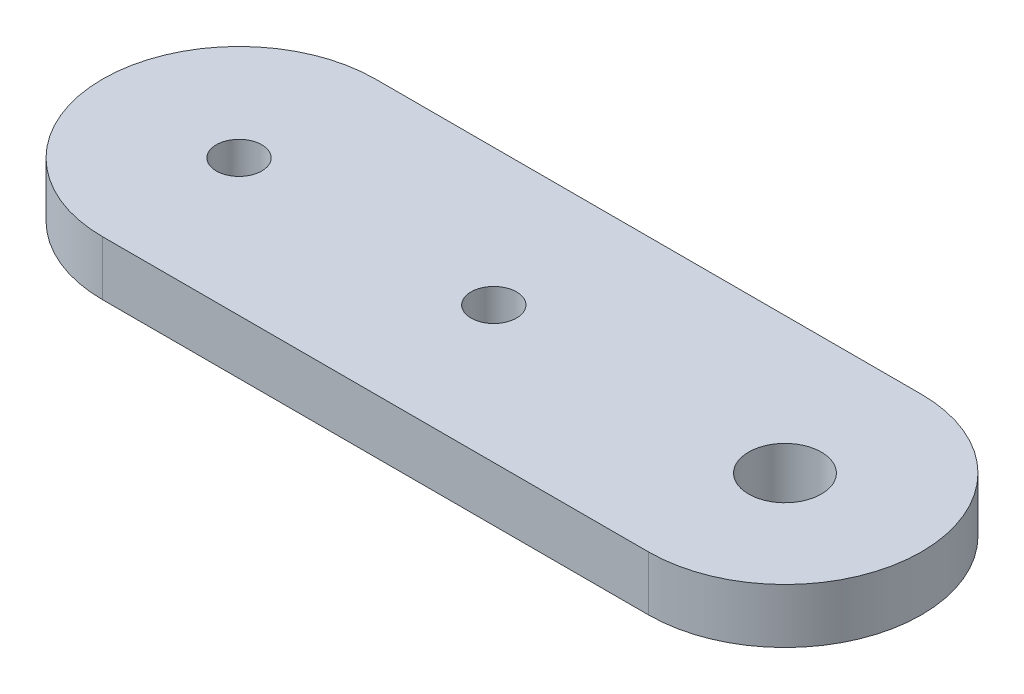
ISO-10303-21;
HEADER;
FILE_DESCRIPTION(('STEP AP214'),'2;1');
FILE_NAME('part.step','',(''),(''),'','','');
FILE_SCHEMA(('AUTOMOTIVE_DESIGN { 1 0 10303 214 1 1 1 1 }'));
ENDSEC;
DATA;
#1=APPLICATION_CONTEXT('core data for automotive mechanical design processes');
#2=APPLICATION_PROTOCOL_DEFINITION('international standard','automotive_design',2000,#1);
#3=PRODUCT_CONTEXT('',#1,'mechanical');
#4=PRODUCT('Part','Part','',(#3));
#5=PRODUCT_RELATED_PRODUCT_CATEGORY('part','',(#4));
#6=PRODUCT_DEFINITION_FORMATION('','',#4);
#7=PRODUCT_DEFINITION_CONTEXT('part definition',#1,'design');
#8=PRODUCT_DEFINITION('design','',#6,#7);
#9=PRODUCT_DEFINITION_SHAPE('','',#8);
#10=(LENGTH_UNIT() NAMED_UNIT(*) SI_UNIT(.MILLI.,.METRE.));
#11=(NAMED_UNIT(*) PLANE_ANGLE_UNIT() SI_UNIT($,.RADIAN.));
#12=(NAMED_UNIT(*) SI_UNIT($,.STERADIAN.) SOLID_ANGLE_UNIT());
#13=UNCERTAINTY_MEASURE_WITH_UNIT(LENGTH_MEASURE(1.E-05),#10,'distance_accuracy_value','');
#14=(GEOMETRIC_REPRESENTATION_CONTEXT(3) GLOBAL_UNCERTAINTY_ASSIGNED_CONTEXT((#13)) GLOBAL_UNIT_ASSIGNED_CONTEXT((#10,
#11,#12)) REPRESENTATION_CONTEXT('',''));
#15=CARTESIAN_POINT('',(0.,0.,0.));
#16=DIRECTION('',(0.,0.,1.));
#17=DIRECTION('',(1.,0.,0.));
#18=AXIS2_PLACEMENT_3D('',#15,#16,#17);
#19=CARTESIAN_POINT('',(0.,3.,0.));
#20=DIRECTION('',(0.,1.,0.));
#21=DIRECTION('',(0.,0.,1.));
#22=AXIS2_PLACEMENT_3D('',#19,#20,#21);
#23=PLANE('',#22);
#24=CARTESIAN_POINT('',(0.,3.,0.));
#25=DIRECTION('',(0.,1.,0.));
#26=DIRECTION('',(0.,0.,1.));
#27=AXIS2_PLACEMENT_3D('',#24,#25,#26);
#28=CIRCLE('',#27,1.25);
#29=CARTESIAN_POINT('',(0.,3.,1.25));
#30=VERTEX_POINT('',#29);
#31=EDGE_CURVE('E115',#30,#30,#28,.T.);
#32=ORIENTED_EDGE('',*,*,#31,.F.);
#33=EDGE_LOOP('',(#32));
#34=FACE_BOUND('',#33,.T.);
#35=CARTESIAN_POINT('',(0.,3.,0.));
#36=DIRECTION('',(0.,1.,0.));
#37=DIRECTION('',(0.,0.,1.));
#38=AXIS2_PLACEMENT_3D('',#35,#36,#37);
#39=CIRCLE('',#38,7.5);
#40=CARTESIAN_POINT('',(0.,3.,-7.5));
#41=VERTEX_POINT('',#40);
#42=CARTESIAN_POINT('',(0.,3.,7.5));
#43=VERTEX_POINT('',#42);
#44=EDGE_CURVE('E85',#41,#43,#39,.T.);
#45=ORIENTED_EDGE('',*,*,#44,.T.);
#46=DIRECTION('',(1.,0.,0.));
#47=VECTOR('',#46,1.);
#48=CARTESIAN_POINT('',(0.,3.,7.5));
#49=LINE('',#48,#47);
#50=CARTESIAN_POINT('',(30.,3.,7.5));
#51=VERTEX_POINT('',#50);
#52=EDGE_CURVE('E80',#43,#51,#49,.T.);
#53=ORIENTED_EDGE('',*,*,#52,.T.);
#54=CARTESIAN_POINT('',(30.,3.,0.));
#55=DIRECTION('',(0.,1.,0.));
#56=DIRECTION('',(0.,0.,1.));
#57=AXIS2_PLACEMENT_3D('',#54,#55,#56);
#58=CIRCLE('',#57,7.5);
#59=CARTESIAN_POINT('',(30.,3.,-7.5));
#60=VERTEX_POINT('',#59);
#61=EDGE_CURVE('E83',#51,#60,#58,.T.);
#62=ORIENTED_EDGE('',*,*,#61,.T.);
#63=DIRECTION('',(-1.,0.,0.));
#64=VECTOR('',#63,1.);
#65=CARTESIAN_POINT('',(0.,3.,-7.5));
#66=LINE('',#65,#64);
#67=EDGE_CURVE('E50',#60,#41,#66,.T.);
#68=ORIENTED_EDGE('',*,*,#67,.T.);
#69=EDGE_LOOP('',(#45,#53,#62,#68));
#70=FACE_BOUND('',#69,.T.);
#71=CARTESIAN_POINT('',(30.,3.,0.));
#72=DIRECTION('',(0.,1.,0.));
#73=DIRECTION('',(0.,0.,1.));
#74=AXIS2_PLACEMENT_3D('',#71,#72,#73);
#75=CIRCLE('',#74,2.);
#76=CARTESIAN_POINT('',(30.,3.,2.));
#77=VERTEX_POINT('',#76);
#78=EDGE_CURVE('E100',#77,#77,#75,.T.);
#79=ORIENTED_EDGE('',*,*,#78,.F.);
#80=EDGE_LOOP('',(#79));
#81=FACE_BOUND('',#80,.T.);
#82=CARTESIAN_POINT('',(14.,3.,0.));
#83=DIRECTION('',(0.,1.,0.));
#84=DIRECTION('',(0.,0.,1.));
#85=AXIS2_PLACEMENT_3D('',#82,#83,#84);
#86=CIRCLE('',#85,1.25);
#87=CARTESIAN_POINT('',(14.,3.,1.25));
#88=VERTEX_POINT('',#87);
#89=EDGE_CURVE('E121',#88,#88,#86,.T.);
#90=ORIENTED_EDGE('',*,*,#89,.F.);
#91=EDGE_LOOP('',(#90));
#92=FACE_BOUND('',#91,.T.);
#93=ADVANCED_FACE('F33',(#34,#70,#81,#92),#23,.T.);
#94=CARTESIAN_POINT('',(0.,0.,0.));
#95=DIRECTION('',(0.,1.,0.));
#96=DIRECTION('',(0.,0.,1.));
#97=AXIS2_PLACEMENT_3D('',#94,#95,#96);
#98=PLANE('',#97);
#99=CARTESIAN_POINT('',(0.,0.,0.));
#100=DIRECTION('',(0.,1.,0.));
#101=DIRECTION('',(0.,0.,1.));
#102=AXIS2_PLACEMENT_3D('',#99,#100,#101);
#103=CIRCLE('',#102,7.5);
#104=CARTESIAN_POINT('',(0.,0.,-7.5));
#105=VERTEX_POINT('',#104);
#106=CARTESIAN_POINT('',(0.,0.,7.5));
#107=VERTEX_POINT('',#106);
#108=EDGE_CURVE('E97',#105,#107,#103,.T.);
#109=ORIENTED_EDGE('',*,*,#108,.F.);
#110=DIRECTION('',(-1.,0.,0.));
#111=VECTOR('',#110,1.);
#112=CARTESIAN_POINT('',(0.,0.,-7.5));
#113=LINE('',#112,#111);
#114=CARTESIAN_POINT('',(30.,0.,-7.5));
#115=VERTEX_POINT('',#114);
#116=EDGE_CURVE('E73',#115,#105,#113,.T.);
#117=ORIENTED_EDGE('',*,*,#116,.F.);
#118=CARTESIAN_POINT('',(30.,0.,0.));
#119=DIRECTION('',(0.,1.,0.));
#120=DIRECTION('',(0.,0.,1.));
#121=AXIS2_PLACEMENT_3D('',#118,#119,#120);
#122=CIRCLE('',#121,7.5);
#123=CARTESIAN_POINT('',(30.,0.,7.5));
#124=VERTEX_POINT('',#123);
#125=EDGE_CURVE('E67',#124,#115,#122,.T.);
#126=ORIENTED_EDGE('',*,*,#125,.F.);
#127=DIRECTION('',(1.,0.,0.));
#128=VECTOR('',#127,1.);
#129=CARTESIAN_POINT('',(0.,0.,7.5));
#130=LINE('',#129,#128);
#131=EDGE_CURVE('E89',#107,#124,#130,.T.);
#132=ORIENTED_EDGE('',*,*,#131,.F.);
#133=EDGE_LOOP('',(#109,#117,#126,#132));
#134=FACE_BOUND('',#133,.T.);
#135=CARTESIAN_POINT('',(30.,0.,0.));
#136=DIRECTION('',(0.,1.,0.));
#137=DIRECTION('',(0.,0.,1.));
#138=AXIS2_PLACEMENT_3D('',#135,#136,#137);
#139=CIRCLE('',#138,2.);
#140=CARTESIAN_POINT('',(30.,0.,2.));
#141=VERTEX_POINT('',#140);
#142=EDGE_CURVE('E112',#141,#141,#139,.T.);
#143=ORIENTED_EDGE('',*,*,#142,.T.);
#144=EDGE_LOOP('',(#143));
#145=FACE_BOUND('',#144,.T.);
#146=CARTESIAN_POINT('',(0.,0.,0.));
#147=DIRECTION('',(0.,1.,0.));
#148=DIRECTION('',(0.,0.,1.));
#149=AXIS2_PLACEMENT_3D('',#146,#147,#148);
#150=CIRCLE('',#149,1.25);
#151=CARTESIAN_POINT('',(0.,0.,1.25));
#152=VERTEX_POINT('',#151);
#153=EDGE_CURVE('E118',#152,#152,#150,.T.);
#154=ORIENTED_EDGE('',*,*,#153,.T.);
#155=EDGE_LOOP('',(#154));
#156=FACE_BOUND('',#155,.T.);
#157=CARTESIAN_POINT('',(14.,0.,0.));
#158=DIRECTION('',(0.,1.,0.));
#159=DIRECTION('',(0.,0.,1.));
#160=AXIS2_PLACEMENT_3D('',#157,#158,#159);
#161=CIRCLE('',#160,1.25);
#162=CARTESIAN_POINT('',(14.,0.,1.25));
#163=VERTEX_POINT('',#162);
#164=EDGE_CURVE('E124',#163,#163,#161,.T.);
#165=ORIENTED_EDGE('',*,*,#164,.T.);
#166=EDGE_LOOP('',(#165));
#167=FACE_BOUND('',#166,.T.);
#168=ADVANCED_FACE('F108',(#134,#145,#156,#167),#98,.F.);
#169=CARTESIAN_POINT('',(0.,3.,0.));
#170=DIRECTION('',(0.,-1.,0.));
#171=DIRECTION('',(0.,0.,-1.));
#172=AXIS2_PLACEMENT_3D('',#169,#170,#171);
#173=CYLINDRICAL_SURFACE('',#172,7.5);
#174=ORIENTED_EDGE('',*,*,#108,.T.);
#175=DIRECTION('',(0.,-1.,0.));
#176=VECTOR('',#175,1.);
#177=CARTESIAN_POINT('',(0.,3.,7.5));
#178=LINE('',#177,#176);
#179=EDGE_CURVE('E11',#43,#107,#178,.T.);
#180=ORIENTED_EDGE('',*,*,#179,.F.);
#181=ORIENTED_EDGE('',*,*,#44,.F.);
#182=DIRECTION('',(0.,-1.,0.));
#183=VECTOR('',#182,1.);
#184=CARTESIAN_POINT('',(0.,3.,-7.5));
#185=LINE('',#184,#183);
#186=EDGE_CURVE('E93',#41,#105,#185,.T.);
#187=ORIENTED_EDGE('',*,*,#186,.T.);
#188=EDGE_LOOP('',(#174,#180,#181,#187));
#189=FACE_BOUND('',#188,.T.);
#190=ADVANCED_FACE('F35',(#189),#173,.T.);
#191=CARTESIAN_POINT('',(0.,3.,7.5));
#192=DIRECTION('',(0.,0.,-1.));
#193=DIRECTION('',(-1.,0.,0.));
#194=AXIS2_PLACEMENT_3D('',#191,#192,#193);
#195=PLANE('',#194);
#196=ORIENTED_EDGE('',*,*,#131,.T.);
#197=DIRECTION('',(0.,-1.,0.));
#198=VECTOR('',#197,1.);
#199=CARTESIAN_POINT('',(30.,3.,7.5));
#200=LINE('',#199,#198);
#201=EDGE_CURVE('E42',#51,#124,#200,.T.);
#202=ORIENTED_EDGE('',*,*,#201,.F.);
#203=ORIENTED_EDGE('',*,*,#52,.F.);
#204=ORIENTED_EDGE('',*,*,#179,.T.);
#205=EDGE_LOOP('',(#196,#202,#203,#204));
#206=FACE_BOUND('',#205,.T.);
#207=ADVANCED_FACE('F88',(#206),#195,.F.);
#208=CARTESIAN_POINT('',(30.,3.,0.));
#209=DIRECTION('',(0.,-1.,0.));
#210=DIRECTION('',(0.,0.,-1.));
#211=AXIS2_PLACEMENT_3D('',#208,#209,#210);
#212=CYLINDRICAL_SURFACE('',#211,7.5);
#213=ORIENTED_EDGE('',*,*,#125,.T.);
#214=DIRECTION('',(0.,-1.,0.));
#215=VECTOR('',#214,1.);
#216=CARTESIAN_POINT('',(30.,3.,-7.5));
#217=LINE('',#216,#215);
#218=EDGE_CURVE('E90',#60,#115,#217,.T.);
#219=ORIENTED_EDGE('',*,*,#218,.F.);
#220=ORIENTED_EDGE('',*,*,#61,.F.);
#221=ORIENTED_EDGE('',*,*,#201,.T.);
#222=EDGE_LOOP('',(#213,#219,#220,#221));
#223=FACE_BOUND('',#222,.T.);
#224=ADVANCED_FACE('F91',(#223),#212,.T.);
#225=CARTESIAN_POINT('',(0.,3.,-7.5));
#226=DIRECTION('',(0.,0.,1.));
#227=DIRECTION('',(1.,0.,0.));
#228=AXIS2_PLACEMENT_3D('',#225,#226,#227);
#229=PLANE('',#228);
#230=ORIENTED_EDGE('',*,*,#116,.T.);
#231=ORIENTED_EDGE('',*,*,#186,.F.);
#232=ORIENTED_EDGE('',*,*,#67,.F.);
#233=ORIENTED_EDGE('',*,*,#218,.T.);
#234=EDGE_LOOP('',(#230,#231,#232,#233));
#235=FACE_BOUND('',#234,.T.);
#236=ADVANCED_FACE('F105',(#235),#229,.F.);
#237=CARTESIAN_POINT('',(30.,3.,0.));
#238=DIRECTION('',(0.,-1.,0.));
#239=DIRECTION('',(0.,0.,-1.));
#240=AXIS2_PLACEMENT_3D('',#237,#238,#239);
#241=CYLINDRICAL_SURFACE('',#240,2.);
#242=ORIENTED_EDGE('',*,*,#78,.T.);
#243=EDGE_LOOP('',(#242));
#244=FACE_BOUND('',#243,.T.);
#245=ORIENTED_EDGE('',*,*,#142,.F.);
#246=EDGE_LOOP('',(#245));
#247=FACE_BOUND('',#246,.T.);
#248=ADVANCED_FACE('F142',(#244,#247),#241,.F.);
#249=CARTESIAN_POINT('',(0.,3.,0.));
#250=DIRECTION('',(0.,-1.,0.));
#251=DIRECTION('',(0.,0.,-1.));
#252=AXIS2_PLACEMENT_3D('',#249,#250,#251);
#253=CYLINDRICAL_SURFACE('',#252,1.25);
#254=ORIENTED_EDGE('',*,*,#31,.T.);
#255=EDGE_LOOP('',(#254));
#256=FACE_BOUND('',#255,.T.);
#257=ORIENTED_EDGE('',*,*,#153,.F.);
#258=EDGE_LOOP('',(#257));
#259=FACE_BOUND('',#258,.T.);
#260=ADVANCED_FACE('F188',(#256,#259),#253,.F.);
#261=CARTESIAN_POINT('',(14.,3.,0.));
#262=DIRECTION('',(0.,-1.,0.));
#263=DIRECTION('',(0.,0.,-1.));
#264=AXIS2_PLACEMENT_3D('',#261,#262,#263);
#265=CYLINDRICAL_SURFACE('',#264,1.25);
#266=ORIENTED_EDGE('',*,*,#89,.T.);
#267=EDGE_LOOP('',(#266));
#268=FACE_BOUND('',#267,.T.);
#269=ORIENTED_EDGE('',*,*,#164,.F.);
#270=EDGE_LOOP('',(#269));
#271=FACE_BOUND('',#270,.T.);
#272=ADVANCED_FACE('F130',(#268,#271),#265,.F.);
#273=CLOSED_SHELL('',(#93,#168,#190,#207,#224,#236,#248,#260,#272));
#274=MANIFOLD_SOLID_BREP('B2',#273);
#275=ADVANCED_BREP_SHAPE_REPRESENTATION('',(#18,#274),#14);
#276=SHAPE_DEFINITION_REPRESENTATION(#9,#275);
ENDSEC;
END-ISO-10303-21;
